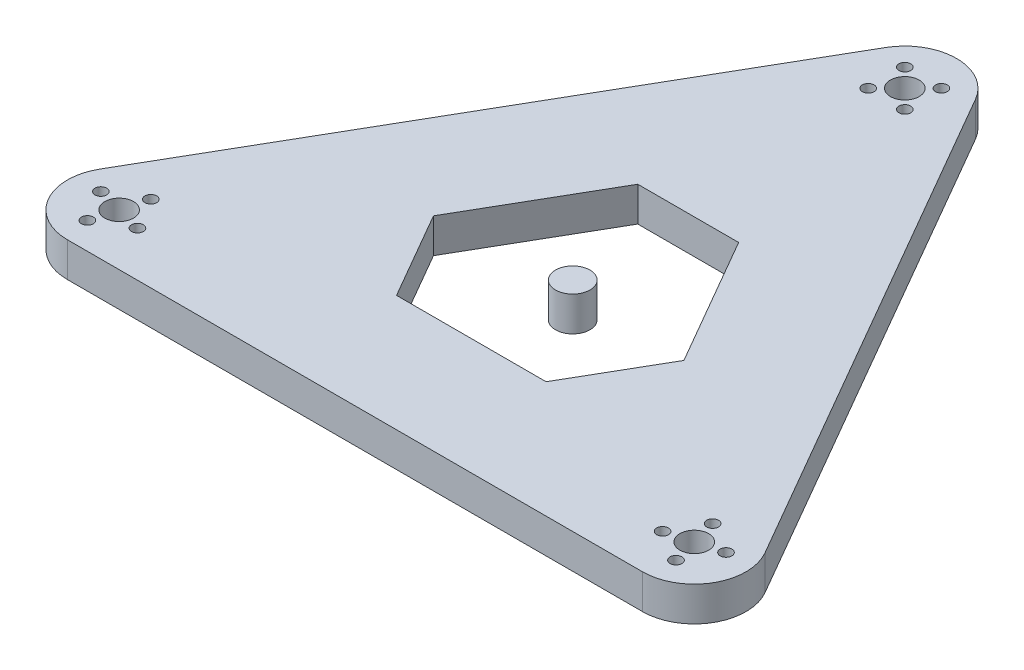
ISO-10303-21;
HEADER;
FILE_DESCRIPTION(('STEP AP214'),'2;1');
FILE_NAME('part.step','',(''),(''),'','','');
FILE_SCHEMA(('AUTOMOTIVE_DESIGN { 1 0 10303 214 1 1 1 1 }'));
ENDSEC;
DATA;
#1=APPLICATION_CONTEXT('core data for automotive mechanical design processes');
#2=APPLICATION_PROTOCOL_DEFINITION('international standard','automotive_design',2000,#1);
#3=PRODUCT_CONTEXT('',#1,'mechanical');
#4=PRODUCT('Part','Part','',(#3));
#5=PRODUCT_RELATED_PRODUCT_CATEGORY('part','',(#4));
#6=PRODUCT_DEFINITION_FORMATION('','',#4);
#7=PRODUCT_DEFINITION_CONTEXT('part definition',#1,'design');
#8=PRODUCT_DEFINITION('design','',#6,#7);
#9=PRODUCT_DEFINITION_SHAPE('','',#8);
#10=(LENGTH_UNIT() NAMED_UNIT(*) SI_UNIT(.MILLI.,.METRE.));
#11=(NAMED_UNIT(*) PLANE_ANGLE_UNIT() SI_UNIT($,.RADIAN.));
#12=(NAMED_UNIT(*) SI_UNIT($,.STERADIAN.) SOLID_ANGLE_UNIT());
#13=UNCERTAINTY_MEASURE_WITH_UNIT(LENGTH_MEASURE(1.E-05),#10,'distance_accuracy_value','');
#14=(GEOMETRIC_REPRESENTATION_CONTEXT(3) GLOBAL_UNCERTAINTY_ASSIGNED_CONTEXT((#13)) GLOBAL_UNIT_ASSIGNED_CONTEXT((#10,
#11,#12)) REPRESENTATION_CONTEXT('',''));
#15=CARTESIAN_POINT('',(0.,0.,0.));
#16=DIRECTION('',(0.,0.,1.));
#17=DIRECTION('',(1.,0.,0.));
#18=AXIS2_PLACEMENT_3D('',#15,#16,#17);
#19=CARTESIAN_POINT('',(0.,12.,0.));
#20=DIRECTION('',(0.,-1.,0.));
#21=DIRECTION('',(0.,0.,-1.));
#22=AXIS2_PLACEMENT_3D('',#19,#20,#21);
#23=CYLINDRICAL_SURFACE('',#22,6.);
#24=CARTESIAN_POINT('',(0.,12.,0.));
#25=DIRECTION('',(0.,1.,0.));
#26=DIRECTION('',(0.,0.,1.));
#27=AXIS2_PLACEMENT_3D('',#24,#25,#26);
#28=CIRCLE('',#27,6.);
#29=CARTESIAN_POINT('',(0.,12.,6.));
#30=VERTEX_POINT('',#29);
#31=EDGE_CURVE('E12',#30,#30,#28,.T.);
#32=ORIENTED_EDGE('',*,*,#31,.F.);
#33=EDGE_LOOP('',(#32));
#34=FACE_BOUND('',#33,.T.);
#35=CARTESIAN_POINT('',(0.,0.,0.));
#36=DIRECTION('',(0.,1.,0.));
#37=DIRECTION('',(0.,0.,1.));
#38=AXIS2_PLACEMENT_3D('',#35,#36,#37);
#39=CIRCLE('',#38,6.);
#40=CARTESIAN_POINT('',(0.,0.,6.));
#41=VERTEX_POINT('',#40);
#42=EDGE_CURVE('E77',#41,#41,#39,.T.);
#43=ORIENTED_EDGE('',*,*,#42,.T.);
#44=EDGE_LOOP('',(#43));
#45=FACE_BOUND('',#44,.T.);
#46=ADVANCED_FACE('F74',(#34,#45),#23,.T.);
#47=CARTESIAN_POINT('',(0.,12.,0.));
#48=DIRECTION('',(0.,1.,0.));
#49=DIRECTION('',(0.,0.,1.));
#50=AXIS2_PLACEMENT_3D('',#47,#48,#49);
#51=PLANE('',#50);
#52=ORIENTED_EDGE('',*,*,#31,.T.);
#53=EDGE_LOOP('',(#52));
#54=FACE_BOUND('',#53,.T.);
#55=ADVANCED_FACE('F89',(#54),#51,.T.);
#56=CARTESIAN_POINT('',(0.,0.,0.));
#57=DIRECTION('',(0.,1.,0.));
#58=DIRECTION('',(0.,0.,1.));
#59=AXIS2_PLACEMENT_3D('',#56,#57,#58);
#60=PLANE('',#59);
#61=ORIENTED_EDGE('',*,*,#42,.F.);
#62=EDGE_LOOP('',(#61));
#63=FACE_BOUND('',#62,.T.);
#64=ADVANCED_FACE('F87',(#63),#60,.F.);
#65=CLOSED_SHELL('',(#46,#55,#64));
#66=MANIFOLD_SOLID_BREP('B2',#65);
#67=CARTESIAN_POINT('',(100.,12.,57.7350269189626));
#68=DIRECTION('',(0.,-1.,0.));
#69=DIRECTION('',(0.,0.,-1.));
#70=AXIS2_PLACEMENT_3D('',#67,#68,#69);
#71=CYLINDRICAL_SURFACE('',#70,18.);
#72=CARTESIAN_POINT('',(100.,0.,57.7350269189626));
#73=DIRECTION('',(0.,1.,0.));
#74=DIRECTION('',(0.,0.,1.));
#75=AXIS2_PLACEMENT_3D('',#72,#73,#74);
#76=CIRCLE('',#75,18.);
#77=CARTESIAN_POINT('',(115.58845726812,0.,48.7350269189625));
#78=VERTEX_POINT('',#77);
#79=CARTESIAN_POINT('',(100.,0.,75.7350269189626));
#80=VERTEX_POINT('',#79);
#81=EDGE_CURVE('E299',#78,#80,#76,.F.);
#82=ORIENTED_EDGE('',*,*,#81,.F.);
#83=DIRECTION('',(0.,-1.,0.));
#84=VECTOR('',#83,1.);
#85=CARTESIAN_POINT('',(115.58845726812,12.,48.7350269189625));
#86=LINE('',#85,#84);
#87=CARTESIAN_POINT('',(115.58845726812,12.,48.7350269189625));
#88=VERTEX_POINT('',#87);
#89=EDGE_CURVE('E72',#88,#78,#86,.T.);
#90=ORIENTED_EDGE('',*,*,#89,.F.);
#91=CARTESIAN_POINT('',(100.,12.,57.7350269189626));
#92=DIRECTION('',(0.,1.,0.));
#93=DIRECTION('',(0.,0.,1.));
#94=AXIS2_PLACEMENT_3D('',#91,#92,#93);
#95=CIRCLE('',#94,18.);
#96=CARTESIAN_POINT('',(100.,12.,75.7350269189626));
#97=VERTEX_POINT('',#96);
#98=EDGE_CURVE('E407',#88,#97,#95,.F.);
#99=ORIENTED_EDGE('',*,*,#98,.T.);
#100=DIRECTION('',(0.,-1.,0.));
#101=VECTOR('',#100,1.);
#102=CARTESIAN_POINT('',(100.,12.,75.7350269189626));
#103=LINE('',#102,#101);
#104=EDGE_CURVE('E180',#97,#80,#103,.T.);
#105=ORIENTED_EDGE('',*,*,#104,.T.);
#106=EDGE_LOOP('',(#82,#90,#99,#105));
#107=FACE_BOUND('',#106,.T.);
#108=ADVANCED_FACE('F115',(#107),#71,.T.);
#109=CARTESIAN_POINT('',(65.5884572681199,12.,-37.8675134594813));
#110=DIRECTION('',(-0.866025403784439,0.,0.5));
#111=DIRECTION('',(0.5,0.,0.866025403784439));
#112=AXIS2_PLACEMENT_3D('',#109,#110,#111);
#113=PLANE('',#112);
#114=DIRECTION('',(-0.5,0.,-0.866025403784439));
#115=VECTOR('',#114,1.);
#116=CARTESIAN_POINT('',(65.5884572681199,0.,-37.8675134594813));
#117=LINE('',#116,#115);
#118=CARTESIAN_POINT('',(15.5884572681199,0.,-124.470053837925));
#119=VERTEX_POINT('',#118);
#120=EDGE_CURVE('E302',#78,#119,#117,.T.);
#121=ORIENTED_EDGE('',*,*,#120,.T.);
#122=DIRECTION('',(0.,-1.,0.));
#123=VECTOR('',#122,1.);
#124=CARTESIAN_POINT('',(15.5884572681199,12.,-124.470053837925));
#125=LINE('',#124,#123);
#126=CARTESIAN_POINT('',(15.5884572681199,12.,-124.470053837925));
#127=VERTEX_POINT('',#126);
#128=EDGE_CURVE('E125',#127,#119,#125,.T.);
#129=ORIENTED_EDGE('',*,*,#128,.F.);
#130=DIRECTION('',(-0.5,0.,-0.866025403784439));
#131=VECTOR('',#130,1.);
#132=CARTESIAN_POINT('',(65.5884572681199,12.,-37.8675134594813));
#133=LINE('',#132,#131);
#134=EDGE_CURVE('E409',#88,#127,#133,.T.);
#135=ORIENTED_EDGE('',*,*,#134,.F.);
#136=ORIENTED_EDGE('',*,*,#89,.T.);
#137=EDGE_LOOP('',(#121,#129,#135,#136));
#138=FACE_BOUND('',#137,.T.);
#139=ADVANCED_FACE('F413',(#138),#113,.F.);
#140=CARTESIAN_POINT('',(0.,12.,-115.470053837925));
#141=DIRECTION('',(0.,-1.,0.));
#142=DIRECTION('',(0.,0.,-1.));
#143=AXIS2_PLACEMENT_3D('',#140,#141,#142);
#144=CYLINDRICAL_SURFACE('',#143,18.);
#145=CARTESIAN_POINT('',(0.,0.,-115.470053837925));
#146=DIRECTION('',(0.,1.,0.));
#147=DIRECTION('',(0.,0.,1.));
#148=AXIS2_PLACEMENT_3D('',#145,#146,#147);
#149=CIRCLE('',#148,18.);
#150=CARTESIAN_POINT('',(-15.5884572681199,0.,-124.470053837925));
#151=VERTEX_POINT('',#150);
#152=EDGE_CURVE('E305',#119,#151,#149,.T.);
#153=ORIENTED_EDGE('',*,*,#152,.T.);
#154=DIRECTION('',(0.,-1.,0.));
#155=VECTOR('',#154,1.);
#156=CARTESIAN_POINT('',(-15.5884572681199,12.,-124.470053837925));
#157=LINE('',#156,#155);
#158=CARTESIAN_POINT('',(-15.5884572681199,12.,-124.470053837925));
#159=VERTEX_POINT('',#158);
#160=EDGE_CURVE('E233',#159,#151,#157,.T.);
#161=ORIENTED_EDGE('',*,*,#160,.F.);
#162=CARTESIAN_POINT('',(0.,12.,-115.470053837925));
#163=DIRECTION('',(0.,1.,0.));
#164=DIRECTION('',(0.,0.,1.));
#165=AXIS2_PLACEMENT_3D('',#162,#163,#164);
#166=CIRCLE('',#165,18.);
#167=EDGE_CURVE('E221',#127,#159,#166,.T.);
#168=ORIENTED_EDGE('',*,*,#167,.F.);
#169=ORIENTED_EDGE('',*,*,#128,.T.);
#170=EDGE_LOOP('',(#153,#161,#168,#169));
#171=FACE_BOUND('',#170,.T.);
#172=ADVANCED_FACE('F416',(#171),#144,.T.);
#173=CARTESIAN_POINT('',(-65.5884572681199,12.,-37.8675134594813));
#174=DIRECTION('',(0.866025403784438,0.,0.5));
#175=DIRECTION('',(0.5,0.,-0.866025403784439));
#176=AXIS2_PLACEMENT_3D('',#173,#174,#175);
#177=PLANE('',#176);
#178=DIRECTION('',(-0.5,0.,0.866025403784439));
#179=VECTOR('',#178,1.);
#180=CARTESIAN_POINT('',(-65.5884572681199,0.,-37.8675134594813));
#181=LINE('',#180,#179);
#182=CARTESIAN_POINT('',(-115.58845726812,0.,48.7350269189626));
#183=VERTEX_POINT('',#182);
#184=EDGE_CURVE('E229',#151,#183,#181,.T.);
#185=ORIENTED_EDGE('',*,*,#184,.T.);
#186=DIRECTION('',(0.,-1.,0.));
#187=VECTOR('',#186,1.);
#188=CARTESIAN_POINT('',(-115.58845726812,12.,48.7350269189626));
#189=LINE('',#188,#187);
#190=CARTESIAN_POINT('',(-115.58845726812,12.,48.7350269189626));
#191=VERTEX_POINT('',#190);
#192=EDGE_CURVE('E227',#191,#183,#189,.T.);
#193=ORIENTED_EDGE('',*,*,#192,.F.);
#194=DIRECTION('',(-0.5,0.,0.866025403784439));
#195=VECTOR('',#194,1.);
#196=CARTESIAN_POINT('',(-65.5884572681199,12.,-37.8675134594813));
#197=LINE('',#196,#195);
#198=EDGE_CURVE('E214',#159,#191,#197,.T.);
#199=ORIENTED_EDGE('',*,*,#198,.F.);
#200=ORIENTED_EDGE('',*,*,#160,.T.);
#201=EDGE_LOOP('',(#185,#193,#199,#200));
#202=FACE_BOUND('',#201,.T.);
#203=ADVANCED_FACE('F228',(#202),#177,.F.);
#204=CARTESIAN_POINT('',(-100.,12.,57.7350269189626));
#205=DIRECTION('',(0.,-1.,0.));
#206=DIRECTION('',(0.,0.,-1.));
#207=AXIS2_PLACEMENT_3D('',#204,#205,#206);
#208=CYLINDRICAL_SURFACE('',#207,18.);
#209=CARTESIAN_POINT('',(-100.,0.,57.7350269189626));
#210=DIRECTION('',(0.,1.,0.));
#211=DIRECTION('',(0.,0.,1.));
#212=AXIS2_PLACEMENT_3D('',#209,#210,#211);
#213=CIRCLE('',#212,18.);
#214=CARTESIAN_POINT('',(-100.,0.,75.7350269189626));
#215=VERTEX_POINT('',#214);
#216=EDGE_CURVE('E309',#215,#183,#213,.F.);
#217=ORIENTED_EDGE('',*,*,#216,.F.);
#218=DIRECTION('',(0.,-1.,0.));
#219=VECTOR('',#218,1.);
#220=CARTESIAN_POINT('',(-100.,12.,75.7350269189626));
#221=LINE('',#220,#219);
#222=CARTESIAN_POINT('',(-100.,12.,75.7350269189626));
#223=VERTEX_POINT('',#222);
#224=EDGE_CURVE('E173',#223,#215,#221,.T.);
#225=ORIENTED_EDGE('',*,*,#224,.F.);
#226=CARTESIAN_POINT('',(-100.,12.,57.7350269189626));
#227=DIRECTION('',(0.,1.,0.));
#228=DIRECTION('',(0.,0.,1.));
#229=AXIS2_PLACEMENT_3D('',#226,#227,#228);
#230=CIRCLE('',#229,18.);
#231=EDGE_CURVE('E219',#223,#191,#230,.F.);
#232=ORIENTED_EDGE('',*,*,#231,.T.);
#233=ORIENTED_EDGE('',*,*,#192,.T.);
#234=EDGE_LOOP('',(#217,#225,#232,#233));
#235=FACE_BOUND('',#234,.T.);
#236=ADVANCED_FACE('F235',(#235),#208,.T.);
#237=CARTESIAN_POINT('',(-34.7733831043548,12.,20.0764220959333));
#238=DIRECTION('',(-0.866025403784438,0.,0.500000000000001));
#239=DIRECTION('',(0.500000000000001,0.,0.866025403784438));
#240=AXIS2_PLACEMENT_3D('',#237,#238,#239);
#241=PLANE('',#240);
#242=DIRECTION('',(-0.500000000000001,0.,-0.866025403784438));
#243=VECTOR('',#242,1.);
#244=CARTESIAN_POINT('',(-34.7733831043548,0.,20.0764220959333));
#245=LINE('',#244,#243);
#246=CARTESIAN_POINT('',(-26.0052928171816,0.,35.2631999586683));
#247=VERTEX_POINT('',#246);
#248=CARTESIAN_POINT('',(-43.541473391528,0.,4.88964423319812));
#249=VERTEX_POINT('',#248);
#250=EDGE_CURVE('E286',#247,#249,#245,.T.);
#251=ORIENTED_EDGE('',*,*,#250,.T.);
#252=DIRECTION('',(0.,-1.,0.));
#253=VECTOR('',#252,1.);
#254=CARTESIAN_POINT('',(-43.541473391528,12.,4.88964423319812));
#255=LINE('',#254,#253);
#256=CARTESIAN_POINT('',(-43.541473391528,12.,4.88964423319812));
#257=VERTEX_POINT('',#256);
#258=EDGE_CURVE('E119',#257,#249,#255,.T.);
#259=ORIENTED_EDGE('',*,*,#258,.F.);
#260=DIRECTION('',(-0.500000000000001,0.,-0.866025403784438));
#261=VECTOR('',#260,1.);
#262=CARTESIAN_POINT('',(-34.7733831043548,12.,20.0764220959333));
#263=LINE('',#262,#261);
#264=CARTESIAN_POINT('',(-26.0052928171816,12.,35.2631999586683));
#265=VERTEX_POINT('',#264);
#266=EDGE_CURVE('E778',#265,#257,#263,.T.);
#267=ORIENTED_EDGE('',*,*,#266,.F.);
#268=DIRECTION('',(0.,-1.,0.));
#269=VECTOR('',#268,1.);
#270=CARTESIAN_POINT('',(-26.0052928171816,12.,35.2631999586683));
#271=LINE('',#270,#269);
#272=EDGE_CURVE('E282',#265,#247,#271,.T.);
#273=ORIENTED_EDGE('',*,*,#272,.T.);
#274=EDGE_LOOP('',(#251,#259,#267,#273));
#275=FACE_BOUND('',#274,.T.);
#276=ADVANCED_FACE('F381',(#275),#241,.F.);
#277=CARTESIAN_POINT('',(-30.5388269829372,12.,-17.6315999793342));
#278=DIRECTION('',(-0.866025403784439,0.,-0.5));
#279=DIRECTION('',(-0.5,0.,0.866025403784439));
#280=AXIS2_PLACEMENT_3D('',#277,#278,#279);
#281=PLANE('',#280);
#282=DIRECTION('',(0.5,0.,-0.866025403784439));
#283=VECTOR('',#282,1.);
#284=CARTESIAN_POINT('',(-30.5388269829372,0.,-17.6315999793342));
#285=LINE('',#284,#283);
#286=CARTESIAN_POINT('',(-17.5361805743464,0.,-40.1528441918664));
#287=VERTEX_POINT('',#286);
#288=EDGE_CURVE('E289',#249,#287,#285,.T.);
#289=ORIENTED_EDGE('',*,*,#288,.T.);
#290=DIRECTION('',(0.,-1.,0.));
#291=VECTOR('',#290,1.);
#292=CARTESIAN_POINT('',(-17.5361805743464,12.,-40.1528441918664));
#293=LINE('',#292,#291);
#294=CARTESIAN_POINT('',(-17.5361805743464,12.,-40.1528441918664));
#295=VERTEX_POINT('',#294);
#296=EDGE_CURVE('E371',#295,#287,#293,.T.);
#297=ORIENTED_EDGE('',*,*,#296,.F.);
#298=DIRECTION('',(0.5,0.,-0.866025403784439));
#299=VECTOR('',#298,1.);
#300=CARTESIAN_POINT('',(-30.5388269829372,12.,-17.6315999793342));
#301=LINE('',#300,#299);
#302=EDGE_CURVE('E188',#257,#295,#301,.T.);
#303=ORIENTED_EDGE('',*,*,#302,.F.);
#304=ORIENTED_EDGE('',*,*,#258,.T.);
#305=EDGE_LOOP('',(#289,#297,#303,#304));
#306=FACE_BOUND('',#305,.T.);
#307=ADVANCED_FACE('F377',(#306),#281,.F.);
#308=CARTESIAN_POINT('',(0.,12.,-40.1528441918664));
#309=DIRECTION('',(0.,0.,-1.));
#310=DIRECTION('',(-1.,0.,0.));
#311=AXIS2_PLACEMENT_3D('',#308,#309,#310);
#312=PLANE('',#311);
#313=DIRECTION('',(1.,0.,0.));
#314=VECTOR('',#313,1.);
#315=CARTESIAN_POINT('',(0.,0.,-40.1528441918664));
#316=LINE('',#315,#314);
#317=CARTESIAN_POINT('',(17.5361805743462,0.,-40.1528441918664));
#318=VERTEX_POINT('',#317);
#319=EDGE_CURVE('E291',#287,#318,#316,.T.);
#320=ORIENTED_EDGE('',*,*,#319,.T.);
#321=DIRECTION('',(0.,-1.,0.));
#322=VECTOR('',#321,1.);
#323=CARTESIAN_POINT('',(17.5361805743462,12.,-40.1528441918664));
#324=LINE('',#323,#322);
#325=CARTESIAN_POINT('',(17.5361805743462,12.,-40.1528441918664));
#326=VERTEX_POINT('',#325);
#327=EDGE_CURVE('E369',#326,#318,#324,.T.);
#328=ORIENTED_EDGE('',*,*,#327,.F.);
#329=DIRECTION('',(1.,0.,0.));
#330=VECTOR('',#329,1.);
#331=CARTESIAN_POINT('',(0.,12.,-40.1528441918664));
#332=LINE('',#331,#330);
#333=EDGE_CURVE('E399',#295,#326,#332,.T.);
#334=ORIENTED_EDGE('',*,*,#333,.F.);
#335=ORIENTED_EDGE('',*,*,#296,.T.);
#336=EDGE_LOOP('',(#320,#328,#334,#335));
#337=FACE_BOUND('',#336,.T.);
#338=ADVANCED_FACE('F390',(#337),#312,.F.);
#339=CARTESIAN_POINT('',(30.538826982937,12.,-17.6315999793342));
#340=DIRECTION('',(0.866025403784438,0.,-0.500000000000001));
#341=DIRECTION('',(-0.500000000000001,0.,-0.866025403784438));
#342=AXIS2_PLACEMENT_3D('',#339,#340,#341);
#343=PLANE('',#342);
#344=DIRECTION('',(0.500000000000001,0.,0.866025403784438));
#345=VECTOR('',#344,1.);
#346=CARTESIAN_POINT('',(30.538826982937,0.,-17.6315999793342));
#347=LINE('',#346,#345);
#348=CARTESIAN_POINT('',(43.5414733915279,0.,4.8896442331981));
#349=VERTEX_POINT('',#348);
#350=EDGE_CURVE('E293',#318,#349,#347,.T.);
#351=ORIENTED_EDGE('',*,*,#350,.T.);
#352=DIRECTION('',(0.,-1.,0.));
#353=VECTOR('',#352,1.);
#354=CARTESIAN_POINT('',(43.5414733915279,12.,4.8896442331981));
#355=LINE('',#354,#353);
#356=CARTESIAN_POINT('',(43.5414733915279,12.,4.8896442331981));
#357=VERTEX_POINT('',#356);
#358=EDGE_CURVE('E366',#357,#349,#355,.T.);
#359=ORIENTED_EDGE('',*,*,#358,.F.);
#360=DIRECTION('',(0.500000000000001,0.,0.866025403784438));
#361=VECTOR('',#360,1.);
#362=CARTESIAN_POINT('',(30.538826982937,12.,-17.6315999793342));
#363=LINE('',#362,#361);
#364=EDGE_CURVE('E395',#326,#357,#363,.T.);
#365=ORIENTED_EDGE('',*,*,#364,.F.);
#366=ORIENTED_EDGE('',*,*,#327,.T.);
#367=EDGE_LOOP('',(#351,#359,#365,#366));
#368=FACE_BOUND('',#367,.T.);
#369=ADVANCED_FACE('F393',(#368),#343,.F.);
#370=CARTESIAN_POINT('',(34.7733831043547,12.,20.0764220959332));
#371=DIRECTION('',(0.866025403784439,0.,0.5));
#372=DIRECTION('',(0.5,0.,-0.866025403784439));
#373=AXIS2_PLACEMENT_3D('',#370,#371,#372);
#374=PLANE('',#373);
#375=DIRECTION('',(-0.5,0.,0.866025403784439));
#376=VECTOR('',#375,1.);
#377=CARTESIAN_POINT('',(34.7733831043547,0.,20.0764220959332));
#378=LINE('',#377,#376);
#379=CARTESIAN_POINT('',(26.0052928171816,0.,35.2631999586683));
#380=VERTEX_POINT('',#379);
#381=EDGE_CURVE('E295',#349,#380,#378,.T.);
#382=ORIENTED_EDGE('',*,*,#381,.T.);
#383=DIRECTION('',(0.,-1.,0.));
#384=VECTOR('',#383,1.);
#385=CARTESIAN_POINT('',(26.0052928171816,12.,35.2631999586683));
#386=LINE('',#385,#384);
#387=CARTESIAN_POINT('',(26.0052928171816,12.,35.2631999586683));
#388=VERTEX_POINT('',#387);
#389=EDGE_CURVE('E363',#388,#380,#386,.T.);
#390=ORIENTED_EDGE('',*,*,#389,.F.);
#391=DIRECTION('',(-0.5,0.,0.866025403784439));
#392=VECTOR('',#391,1.);
#393=CARTESIAN_POINT('',(34.7733831043547,12.,20.0764220959332));
#394=LINE('',#393,#392);
#395=EDGE_CURVE('E398',#357,#388,#394,.T.);
#396=ORIENTED_EDGE('',*,*,#395,.F.);
#397=ORIENTED_EDGE('',*,*,#358,.T.);
#398=EDGE_LOOP('',(#382,#390,#396,#397));
#399=FACE_BOUND('',#398,.T.);
#400=ADVANCED_FACE('F431',(#399),#374,.F.);
#401=CARTESIAN_POINT('',(102.329371405923,12.,66.4283593555642));
#402=DIRECTION('',(0.,-1.,0.));
#403=DIRECTION('',(0.,0.,-1.));
#404=AXIS2_PLACEMENT_3D('',#401,#402,#403);
#405=CYLINDRICAL_SURFACE('',#404,2.04999999999994);
#406=CARTESIAN_POINT('',(102.329371405923,12.,66.4283593555642));
#407=DIRECTION('',(0.,1.,0.));
#408=DIRECTION('',(0.,0.,1.));
#409=AXIS2_PLACEMENT_3D('',#406,#407,#408);
#410=CIRCLE('',#409,2.04999999999994);
#411=CARTESIAN_POINT('',(102.329371405923,12.,68.4783593555641));
#412=VERTEX_POINT('',#411);
#413=EDGE_CURVE('E276',#412,#412,#410,.T.);
#414=ORIENTED_EDGE('',*,*,#413,.T.);
#415=EDGE_LOOP('',(#414));
#416=FACE_BOUND('',#415,.T.);
#417=CARTESIAN_POINT('',(102.329371405923,0.,66.4283593555642));
#418=DIRECTION('',(0.,1.,0.));
#419=DIRECTION('',(0.,0.,1.));
#420=AXIS2_PLACEMENT_3D('',#417,#418,#419);
#421=CIRCLE('',#420,2.04999999999994);
#422=CARTESIAN_POINT('',(102.329371405923,0.,68.4783593555641));
#423=VERTEX_POINT('',#422);
#424=EDGE_CURVE('E349',#423,#423,#421,.T.);
#425=ORIENTED_EDGE('',*,*,#424,.F.);
#426=EDGE_LOOP('',(#425));
#427=FACE_BOUND('',#426,.T.);
#428=ADVANCED_FACE('F434',(#416,#427),#405,.F.);
#429=CARTESIAN_POINT('',(97.6706285940773,12.,49.041694482361));
#430=DIRECTION('',(0.,-1.,0.));
#431=DIRECTION('',(0.,0.,-1.));
#432=AXIS2_PLACEMENT_3D('',#429,#430,#431);
#433=CYLINDRICAL_SURFACE('',#432,2.05000000000008);
#434=CARTESIAN_POINT('',(97.6706285940773,12.,49.041694482361));
#435=DIRECTION('',(0.,1.,0.));
#436=DIRECTION('',(0.,0.,1.));
#437=AXIS2_PLACEMENT_3D('',#434,#435,#436);
#438=CIRCLE('',#437,2.05000000000008);
#439=CARTESIAN_POINT('',(97.6706285940773,12.,51.091694482361));
#440=VERTEX_POINT('',#439);
#441=EDGE_CURVE('E273',#440,#440,#438,.T.);
#442=ORIENTED_EDGE('',*,*,#441,.T.);
#443=EDGE_LOOP('',(#442));
#444=FACE_BOUND('',#443,.T.);
#445=CARTESIAN_POINT('',(97.6706285940773,0.,49.041694482361));
#446=DIRECTION('',(0.,1.,0.));
#447=DIRECTION('',(0.,0.,1.));
#448=AXIS2_PLACEMENT_3D('',#445,#446,#447);
#449=CIRCLE('',#448,2.05000000000008);
#450=CARTESIAN_POINT('',(97.6706285940773,0.,51.091694482361));
#451=VERTEX_POINT('',#450);
#452=EDGE_CURVE('E346',#451,#451,#449,.T.);
#453=ORIENTED_EDGE('',*,*,#452,.F.);
#454=EDGE_LOOP('',(#453));
#455=FACE_BOUND('',#454,.T.);
#456=ADVANCED_FACE('F504',(#444,#455),#433,.F.);
#457=CARTESIAN_POINT('',(91.3066675633984,12.,60.0643983248853));
#458=DIRECTION('',(0.,-1.,0.));
#459=DIRECTION('',(0.,0.,-1.));
#460=AXIS2_PLACEMENT_3D('',#457,#458,#459);
#461=CYLINDRICAL_SURFACE('',#460,2.05000000000002);
#462=CARTESIAN_POINT('',(91.3066675633984,12.,60.0643983248853));
#463=DIRECTION('',(0.,1.,0.));
#464=DIRECTION('',(0.,0.,1.));
#465=AXIS2_PLACEMENT_3D('',#462,#463,#464);
#466=CIRCLE('',#465,2.05000000000002);
#467=CARTESIAN_POINT('',(91.3066675633984,12.,62.1143983248853));
#468=VERTEX_POINT('',#467);
#469=EDGE_CURVE('E270',#468,#468,#466,.T.);
#470=ORIENTED_EDGE('',*,*,#469,.T.);
#471=EDGE_LOOP('',(#470));
#472=FACE_BOUND('',#471,.T.);
#473=CARTESIAN_POINT('',(91.3066675633984,0.,60.0643983248853));
#474=DIRECTION('',(0.,1.,0.));
#475=DIRECTION('',(0.,0.,1.));
#476=AXIS2_PLACEMENT_3D('',#473,#474,#475);
#477=CIRCLE('',#476,2.05000000000002);
#478=CARTESIAN_POINT('',(91.3066675633984,0.,62.1143983248853));
#479=VERTEX_POINT('',#478);
#480=EDGE_CURVE('E343',#479,#479,#477,.T.);
#481=ORIENTED_EDGE('',*,*,#480,.F.);
#482=EDGE_LOOP('',(#481));
#483=FACE_BOUND('',#482,.T.);
#484=ADVANCED_FACE('F514',(#472,#483),#461,.F.);
#485=CARTESIAN_POINT('',(6.36396103067892,12.,-109.106092807246));
#486=DIRECTION('',(0.,-1.,0.));
#487=DIRECTION('',(0.,0.,-1.));
#488=AXIS2_PLACEMENT_3D('',#485,#486,#487);
#489=CYLINDRICAL_SURFACE('',#488,2.05);
#490=CARTESIAN_POINT('',(6.36396103067892,12.,-109.106092807246));
#491=DIRECTION('',(0.,1.,0.));
#492=DIRECTION('',(0.,0.,1.));
#493=AXIS2_PLACEMENT_3D('',#490,#491,#492);
#494=CIRCLE('',#493,2.05);
#495=CARTESIAN_POINT('',(6.36396103067892,12.,-107.056092807246));
#496=VERTEX_POINT('',#495);
#497=EDGE_CURVE('E267',#496,#496,#494,.T.);
#498=ORIENTED_EDGE('',*,*,#497,.T.);
#499=EDGE_LOOP('',(#498));
#500=FACE_BOUND('',#499,.T.);
#501=CARTESIAN_POINT('',(6.36396103067892,0.,-109.106092807246));
#502=DIRECTION('',(0.,1.,0.));
#503=DIRECTION('',(0.,0.,1.));
#504=AXIS2_PLACEMENT_3D('',#501,#502,#503);
#505=CIRCLE('',#504,2.05);
#506=CARTESIAN_POINT('',(6.36396103067892,0.,-107.056092807246));
#507=VERTEX_POINT('',#506);
#508=EDGE_CURVE('E340',#507,#507,#505,.T.);
#509=ORIENTED_EDGE('',*,*,#508,.F.);
#510=EDGE_LOOP('',(#509));
#511=FACE_BOUND('',#510,.T.);
#512=ADVANCED_FACE('F524',(#500,#511),#489,.F.);
#513=CARTESIAN_POINT('',(-6.36396103067894,12.,-109.106092807246));
#514=DIRECTION('',(0.,-1.,0.));
#515=DIRECTION('',(0.,0.,-1.));
#516=AXIS2_PLACEMENT_3D('',#513,#514,#515);
#517=CYLINDRICAL_SURFACE('',#516,2.05);
#518=CARTESIAN_POINT('',(-6.36396103067894,12.,-109.106092807246));
#519=DIRECTION('',(0.,1.,0.));
#520=DIRECTION('',(0.,0.,1.));
#521=AXIS2_PLACEMENT_3D('',#518,#519,#520);
#522=CIRCLE('',#521,2.05);
#523=CARTESIAN_POINT('',(-6.36396103067894,12.,-107.056092807246));
#524=VERTEX_POINT('',#523);
#525=EDGE_CURVE('E264',#524,#524,#522,.T.);
#526=ORIENTED_EDGE('',*,*,#525,.T.);
#527=EDGE_LOOP('',(#526));
#528=FACE_BOUND('',#527,.T.);
#529=CARTESIAN_POINT('',(-6.36396103067894,0.,-109.106092807246));
#530=DIRECTION('',(0.,1.,0.));
#531=DIRECTION('',(0.,0.,1.));
#532=AXIS2_PLACEMENT_3D('',#529,#530,#531);
#533=CIRCLE('',#532,2.05);
#534=CARTESIAN_POINT('',(-6.36396103067894,0.,-107.056092807246));
#535=VERTEX_POINT('',#534);
#536=EDGE_CURVE('E337',#535,#535,#533,.T.);
#537=ORIENTED_EDGE('',*,*,#536,.F.);
#538=EDGE_LOOP('',(#537));
#539=FACE_BOUND('',#538,.T.);
#540=ADVANCED_FACE('F534',(#528,#539),#517,.F.);
#541=CARTESIAN_POINT('',(6.36396103067892,12.,-121.834014868604));
#542=DIRECTION('',(0.,-1.,0.));
#543=DIRECTION('',(0.,0.,-1.));
#544=AXIS2_PLACEMENT_3D('',#541,#542,#543);
#545=CYLINDRICAL_SURFACE('',#544,2.05);
#546=CARTESIAN_POINT('',(6.36396103067892,12.,-121.834014868604));
#547=DIRECTION('',(0.,1.,0.));
#548=DIRECTION('',(0.,0.,1.));
#549=AXIS2_PLACEMENT_3D('',#546,#547,#548);
#550=CIRCLE('',#549,2.05);
#551=CARTESIAN_POINT('',(6.36396103067892,12.,-119.784014868604));
#552=VERTEX_POINT('',#551);
#553=EDGE_CURVE('E261',#552,#552,#550,.T.);
#554=ORIENTED_EDGE('',*,*,#553,.T.);
#555=EDGE_LOOP('',(#554));
#556=FACE_BOUND('',#555,.T.);
#557=CARTESIAN_POINT('',(6.36396103067892,0.,-121.834014868604));
#558=DIRECTION('',(0.,1.,0.));
#559=DIRECTION('',(0.,0.,1.));
#560=AXIS2_PLACEMENT_3D('',#557,#558,#559);
#561=CIRCLE('',#560,2.05);
#562=CARTESIAN_POINT('',(6.36396103067892,0.,-119.784014868604));
#563=VERTEX_POINT('',#562);
#564=EDGE_CURVE('E334',#563,#563,#561,.T.);
#565=ORIENTED_EDGE('',*,*,#564,.F.);
#566=EDGE_LOOP('',(#565));
#567=FACE_BOUND('',#566,.T.);
#568=ADVANCED_FACE('F544',(#556,#567),#545,.F.);
#569=CARTESIAN_POINT('',(-6.36396103067894,12.,-121.834014868604));
#570=DIRECTION('',(0.,-1.,0.));
#571=DIRECTION('',(0.,0.,-1.));
#572=AXIS2_PLACEMENT_3D('',#569,#570,#571);
#573=CYLINDRICAL_SURFACE('',#572,2.05);
#574=CARTESIAN_POINT('',(-6.36396103067894,12.,-121.834014868604));
#575=DIRECTION('',(0.,1.,0.));
#576=DIRECTION('',(0.,0.,1.));
#577=AXIS2_PLACEMENT_3D('',#574,#575,#576);
#578=CIRCLE('',#577,2.05);
#579=CARTESIAN_POINT('',(-6.36396103067894,12.,-119.784014868604));
#580=VERTEX_POINT('',#579);
#581=EDGE_CURVE('E258',#580,#580,#578,.T.);
#582=ORIENTED_EDGE('',*,*,#581,.T.);
#583=EDGE_LOOP('',(#582));
#584=FACE_BOUND('',#583,.T.);
#585=CARTESIAN_POINT('',(-6.36396103067894,0.,-121.834014868604));
#586=DIRECTION('',(0.,1.,0.));
#587=DIRECTION('',(0.,0.,1.));
#588=AXIS2_PLACEMENT_3D('',#585,#586,#587);
#589=CIRCLE('',#588,2.05);
#590=CARTESIAN_POINT('',(-6.36396103067894,0.,-119.784014868604));
#591=VERTEX_POINT('',#590);
#592=EDGE_CURVE('E331',#591,#591,#589,.T.);
#593=ORIENTED_EDGE('',*,*,#592,.F.);
#594=EDGE_LOOP('',(#593));
#595=FACE_BOUND('',#594,.T.);
#596=ADVANCED_FACE('F554',(#584,#595),#573,.F.);
#597=CARTESIAN_POINT('',(-91.3066675633984,12.,60.0643983248853));
#598=DIRECTION('',(0.,-1.,0.));
#599=DIRECTION('',(0.,0.,-1.));
#600=AXIS2_PLACEMENT_3D('',#597,#598,#599);
#601=CYLINDRICAL_SURFACE('',#600,2.05000000000001);
#602=CARTESIAN_POINT('',(-91.3066675633984,12.,60.0643983248853));
#603=DIRECTION('',(0.,1.,0.));
#604=DIRECTION('',(0.,0.,1.));
#605=AXIS2_PLACEMENT_3D('',#602,#603,#604);
#606=CIRCLE('',#605,2.05000000000001);
#607=CARTESIAN_POINT('',(-91.3066675633984,12.,62.1143983248853));
#608=VERTEX_POINT('',#607);
#609=EDGE_CURVE('E255',#608,#608,#606,.T.);
#610=ORIENTED_EDGE('',*,*,#609,.T.);
#611=EDGE_LOOP('',(#610));
#612=FACE_BOUND('',#611,.T.);
#613=CARTESIAN_POINT('',(-91.3066675633984,0.,60.0643983248853));
#614=DIRECTION('',(0.,1.,0.));
#615=DIRECTION('',(0.,0.,1.));
#616=AXIS2_PLACEMENT_3D('',#613,#614,#615);
#617=CIRCLE('',#616,2.05000000000001);
#618=CARTESIAN_POINT('',(-91.3066675633984,0.,62.1143983248853));
#619=VERTEX_POINT('',#618);
#620=EDGE_CURVE('E328',#619,#619,#617,.T.);
#621=ORIENTED_EDGE('',*,*,#620,.F.);
#622=EDGE_LOOP('',(#621));
#623=FACE_BOUND('',#622,.T.);
#624=ADVANCED_FACE('F564',(#612,#623),#601,.F.);
#625=CARTESIAN_POINT('',(-102.329371405923,12.,66.4283593555642));
#626=DIRECTION('',(0.,-1.,0.));
#627=DIRECTION('',(0.,0.,-1.));
#628=AXIS2_PLACEMENT_3D('',#625,#626,#627);
#629=CYLINDRICAL_SURFACE('',#628,2.04999999999995);
#630=CARTESIAN_POINT('',(-102.329371405923,12.,66.4283593555642));
#631=DIRECTION('',(0.,1.,0.));
#632=DIRECTION('',(0.,0.,1.));
#633=AXIS2_PLACEMENT_3D('',#630,#631,#632);
#634=CIRCLE('',#633,2.04999999999995);
#635=CARTESIAN_POINT('',(-102.329371405923,12.,68.4783593555642));
#636=VERTEX_POINT('',#635);
#637=EDGE_CURVE('E252',#636,#636,#634,.T.);
#638=ORIENTED_EDGE('',*,*,#637,.T.);
#639=EDGE_LOOP('',(#638));
#640=FACE_BOUND('',#639,.T.);
#641=CARTESIAN_POINT('',(-102.329371405923,0.,66.4283593555642));
#642=DIRECTION('',(0.,1.,0.));
#643=DIRECTION('',(0.,0.,1.));
#644=AXIS2_PLACEMENT_3D('',#641,#642,#643);
#645=CIRCLE('',#644,2.04999999999995);
#646=CARTESIAN_POINT('',(-102.329371405923,0.,68.4783593555642));
#647=VERTEX_POINT('',#646);
#648=EDGE_CURVE('E325',#647,#647,#645,.T.);
#649=ORIENTED_EDGE('',*,*,#648,.F.);
#650=EDGE_LOOP('',(#649));
#651=FACE_BOUND('',#650,.T.);
#652=ADVANCED_FACE('F574',(#640,#651),#629,.F.);
#653=CARTESIAN_POINT('',(-97.6706285940773,12.,49.041694482361));
#654=DIRECTION('',(0.,-1.,0.));
#655=DIRECTION('',(0.,0.,-1.));
#656=AXIS2_PLACEMENT_3D('',#653,#654,#655);
#657=CYLINDRICAL_SURFACE('',#656,2.05000000000003);
#658=CARTESIAN_POINT('',(-97.6706285940773,12.,49.041694482361));
#659=DIRECTION('',(0.,1.,0.));
#660=DIRECTION('',(0.,0.,1.));
#661=AXIS2_PLACEMENT_3D('',#658,#659,#660);
#662=CIRCLE('',#661,2.05000000000003);
#663=CARTESIAN_POINT('',(-97.6706285940773,12.,51.091694482361));
#664=VERTEX_POINT('',#663);
#665=EDGE_CURVE('E249',#664,#664,#662,.T.);
#666=ORIENTED_EDGE('',*,*,#665,.T.);
#667=EDGE_LOOP('',(#666));
#668=FACE_BOUND('',#667,.T.);
#669=CARTESIAN_POINT('',(-97.6706285940773,0.,49.041694482361));
#670=DIRECTION('',(0.,1.,0.));
#671=DIRECTION('',(0.,0.,1.));
#672=AXIS2_PLACEMENT_3D('',#669,#670,#671);
#673=CIRCLE('',#672,2.05000000000003);
#674=CARTESIAN_POINT('',(-97.6706285940773,0.,51.091694482361));
#675=VERTEX_POINT('',#674);
#676=EDGE_CURVE('E322',#675,#675,#673,.T.);
#677=ORIENTED_EDGE('',*,*,#676,.F.);
#678=EDGE_LOOP('',(#677));
#679=FACE_BOUND('',#678,.T.);
#680=ADVANCED_FACE('F584',(#668,#679),#657,.F.);
#681=CARTESIAN_POINT('',(-108.693332436602,12.,55.4056555130399));
#682=DIRECTION('',(0.,-1.,0.));
#683=DIRECTION('',(0.,0.,-1.));
#684=AXIS2_PLACEMENT_3D('',#681,#682,#683);
#685=CYLINDRICAL_SURFACE('',#684,2.05000000000003);
#686=CARTESIAN_POINT('',(-108.693332436602,12.,55.4056555130399));
#687=DIRECTION('',(0.,1.,0.));
#688=DIRECTION('',(0.,0.,1.));
#689=AXIS2_PLACEMENT_3D('',#686,#687,#688);
#690=CIRCLE('',#689,2.05000000000003);
#691=CARTESIAN_POINT('',(-108.693332436602,12.,57.4556555130399));
#692=VERTEX_POINT('',#691);
#693=EDGE_CURVE('E246',#692,#692,#690,.T.);
#694=ORIENTED_EDGE('',*,*,#693,.T.);
#695=EDGE_LOOP('',(#694));
#696=FACE_BOUND('',#695,.T.);
#697=CARTESIAN_POINT('',(-108.693332436602,0.,55.4056555130399));
#698=DIRECTION('',(0.,1.,0.));
#699=DIRECTION('',(0.,0.,1.));
#700=AXIS2_PLACEMENT_3D('',#697,#698,#699);
#701=CIRCLE('',#700,2.05000000000003);
#702=CARTESIAN_POINT('',(-108.693332436602,0.,57.4556555130399));
#703=VERTEX_POINT('',#702);
#704=EDGE_CURVE('E319',#703,#703,#701,.T.);
#705=ORIENTED_EDGE('',*,*,#704,.F.);
#706=EDGE_LOOP('',(#705));
#707=FACE_BOUND('',#706,.T.);
#708=ADVANCED_FACE('F594',(#696,#707),#685,.F.);
#709=CARTESIAN_POINT('',(100.,12.,57.7350269189626));
#710=DIRECTION('',(0.,-1.,0.));
#711=DIRECTION('',(0.,0.,-1.));
#712=AXIS2_PLACEMENT_3D('',#709,#710,#711);
#713=CYLINDRICAL_SURFACE('',#712,5.00000000000001);
#714=CARTESIAN_POINT('',(100.,12.,57.7350269189626));
#715=DIRECTION('',(0.,1.,0.));
#716=DIRECTION('',(0.,0.,1.));
#717=AXIS2_PLACEMENT_3D('',#714,#715,#716);
#718=CIRCLE('',#717,5.00000000000001);
#719=CARTESIAN_POINT('',(100.,12.,62.7350269189626));
#720=VERTEX_POINT('',#719);
#721=EDGE_CURVE('E243',#720,#720,#718,.T.);
#722=ORIENTED_EDGE('',*,*,#721,.T.);
#723=EDGE_LOOP('',(#722));
#724=FACE_BOUND('',#723,.T.);
#725=CARTESIAN_POINT('',(100.,0.,57.7350269189626));
#726=DIRECTION('',(0.,1.,0.));
#727=DIRECTION('',(0.,0.,1.));
#728=AXIS2_PLACEMENT_3D('',#725,#726,#727);
#729=CIRCLE('',#728,5.00000000000001);
#730=CARTESIAN_POINT('',(100.,0.,62.7350269189626));
#731=VERTEX_POINT('',#730);
#732=EDGE_CURVE('E316',#731,#731,#729,.T.);
#733=ORIENTED_EDGE('',*,*,#732,.F.);
#734=EDGE_LOOP('',(#733));
#735=FACE_BOUND('',#734,.T.);
#736=ADVANCED_FACE('F604',(#724,#735),#713,.F.);
#737=CARTESIAN_POINT('',(-100.,12.,57.7350269189626));
#738=DIRECTION('',(0.,-1.,0.));
#739=DIRECTION('',(0.,0.,-1.));
#740=AXIS2_PLACEMENT_3D('',#737,#738,#739);
#741=CYLINDRICAL_SURFACE('',#740,5.00000000000002);
#742=CARTESIAN_POINT('',(-100.,12.,57.7350269189626));
#743=DIRECTION('',(0.,1.,0.));
#744=DIRECTION('',(0.,0.,1.));
#745=AXIS2_PLACEMENT_3D('',#742,#743,#744);
#746=CIRCLE('',#745,5.00000000000002);
#747=CARTESIAN_POINT('',(-100.,12.,62.7350269189626));
#748=VERTEX_POINT('',#747);
#749=EDGE_CURVE('E237',#748,#748,#746,.T.);
#750=ORIENTED_EDGE('',*,*,#749,.T.);
#751=EDGE_LOOP('',(#750));
#752=FACE_BOUND('',#751,.T.);
#753=CARTESIAN_POINT('',(-100.,0.,57.7350269189626));
#754=DIRECTION('',(0.,1.,0.));
#755=DIRECTION('',(0.,0.,1.));
#756=AXIS2_PLACEMENT_3D('',#753,#754,#755);
#757=CIRCLE('',#756,5.00000000000002);
#758=CARTESIAN_POINT('',(-100.,0.,62.7350269189626));
#759=VERTEX_POINT('',#758);
#760=EDGE_CURVE('E313',#759,#759,#757,.T.);
#761=ORIENTED_EDGE('',*,*,#760,.F.);
#762=EDGE_LOOP('',(#761));
#763=FACE_BOUND('',#762,.T.);
#764=ADVANCED_FACE('F614',(#752,#763),#741,.F.);
#765=CARTESIAN_POINT('',(0.,12.,75.7350269189626));
#766=DIRECTION('',(0.,0.,-1.));
#767=DIRECTION('',(-1.,0.,0.));
#768=AXIS2_PLACEMENT_3D('',#765,#766,#767);
#769=PLANE('',#768);
#770=DIRECTION('',(1.,0.,0.));
#771=VECTOR('',#770,1.);
#772=CARTESIAN_POINT('',(0.,0.,75.7350269189626));
#773=LINE('',#772,#771);
#774=EDGE_CURVE('E311',#215,#80,#773,.T.);
#775=ORIENTED_EDGE('',*,*,#774,.T.);
#776=ORIENTED_EDGE('',*,*,#104,.F.);
#777=DIRECTION('',(1.,0.,0.));
#778=VECTOR('',#777,1.);
#779=CARTESIAN_POINT('',(0.,12.,75.7350269189626));
#780=LINE('',#779,#778);
#781=EDGE_CURVE('E134',#223,#97,#780,.T.);
#782=ORIENTED_EDGE('',*,*,#781,.F.);
#783=ORIENTED_EDGE('',*,*,#224,.T.);
#784=EDGE_LOOP('',(#775,#776,#782,#783));
#785=FACE_BOUND('',#784,.T.);
#786=ADVANCED_FACE('F418',(#785),#769,.F.);
#787=CARTESIAN_POINT('',(0.,12.,35.2631999586683));
#788=DIRECTION('',(0.,0.,1.));
#789=DIRECTION('',(1.,0.,0.));
#790=AXIS2_PLACEMENT_3D('',#787,#788,#789);
#791=PLANE('',#790);
#792=DIRECTION('',(-1.,0.,0.));
#793=VECTOR('',#792,1.);
#794=CARTESIAN_POINT('',(0.,0.,35.2631999586683));
#795=LINE('',#794,#793);
#796=EDGE_CURVE('E297',#380,#247,#795,.T.);
#797=ORIENTED_EDGE('',*,*,#796,.T.);
#798=ORIENTED_EDGE('',*,*,#272,.F.);
#799=DIRECTION('',(-1.,0.,0.));
#800=VECTOR('',#799,1.);
#801=CARTESIAN_POINT('',(0.,12.,35.2631999586683));
#802=LINE('',#801,#800);
#803=EDGE_CURVE('E401',#388,#265,#802,.T.);
#804=ORIENTED_EDGE('',*,*,#803,.F.);
#805=ORIENTED_EDGE('',*,*,#389,.T.);
#806=EDGE_LOOP('',(#797,#798,#804,#805));
#807=FACE_BOUND('',#806,.T.);
#808=ADVANCED_FACE('F427',(#807),#791,.F.);
#809=CARTESIAN_POINT('',(0.,12.,-115.470053837925));
#810=DIRECTION('',(0.,-1.,0.));
#811=DIRECTION('',(0.,0.,-1.));
#812=AXIS2_PLACEMENT_3D('',#809,#810,#811);
#813=CYLINDRICAL_SURFACE('',#812,5.00000000000001);
#814=CARTESIAN_POINT('',(0.,12.,-115.470053837925));
#815=DIRECTION('',(0.,1.,0.));
#816=DIRECTION('',(0.,0.,1.));
#817=AXIS2_PLACEMENT_3D('',#814,#815,#816);
#818=CIRCLE('',#817,5.00000000000001);
#819=CARTESIAN_POINT('',(0.,12.,-110.470053837925));
#820=VERTEX_POINT('',#819);
#821=EDGE_CURVE('E355',#820,#820,#818,.T.);
#822=ORIENTED_EDGE('',*,*,#821,.T.);
#823=EDGE_LOOP('',(#822));
#824=FACE_BOUND('',#823,.T.);
#825=CARTESIAN_POINT('',(0.,0.,-115.470053837925));
#826=DIRECTION('',(0.,1.,0.));
#827=DIRECTION('',(0.,0.,1.));
#828=AXIS2_PLACEMENT_3D('',#825,#826,#827);
#829=CIRCLE('',#828,5.00000000000001);
#830=CARTESIAN_POINT('',(0.,0.,-110.470053837925));
#831=VERTEX_POINT('',#830);
#832=EDGE_CURVE('E283',#831,#831,#829,.T.);
#833=ORIENTED_EDGE('',*,*,#832,.F.);
#834=EDGE_LOOP('',(#833));
#835=FACE_BOUND('',#834,.T.);
#836=ADVANCED_FACE('F117',(#824,#835),#813,.F.);
#837=CARTESIAN_POINT('',(108.693332436602,12.,55.4056555130399));
#838=DIRECTION('',(0.,-1.,0.));
#839=DIRECTION('',(0.,0.,-1.));
#840=AXIS2_PLACEMENT_3D('',#837,#838,#839);
#841=CYLINDRICAL_SURFACE('',#840,2.04999999999997);
#842=CARTESIAN_POINT('',(108.693332436602,12.,55.4056555130399));
#843=DIRECTION('',(0.,1.,0.));
#844=DIRECTION('',(0.,0.,1.));
#845=AXIS2_PLACEMENT_3D('',#842,#843,#844);
#846=CIRCLE('',#845,2.04999999999997);
#847=CARTESIAN_POINT('',(108.693332436602,12.,57.4556555130398));
#848=VERTEX_POINT('',#847);
#849=EDGE_CURVE('E279',#848,#848,#846,.T.);
#850=ORIENTED_EDGE('',*,*,#849,.T.);
#851=EDGE_LOOP('',(#850));
#852=FACE_BOUND('',#851,.T.);
#853=CARTESIAN_POINT('',(108.693332436602,0.,55.4056555130399));
#854=DIRECTION('',(0.,1.,0.));
#855=DIRECTION('',(0.,0.,1.));
#856=AXIS2_PLACEMENT_3D('',#853,#854,#855);
#857=CIRCLE('',#856,2.04999999999997);
#858=CARTESIAN_POINT('',(108.693332436602,0.,57.4556555130398));
#859=VERTEX_POINT('',#858);
#860=EDGE_CURVE('E352',#859,#859,#857,.T.);
#861=ORIENTED_EDGE('',*,*,#860,.F.);
#862=EDGE_LOOP('',(#861));
#863=FACE_BOUND('',#862,.T.);
#864=ADVANCED_FACE('F648',(#852,#863),#841,.F.);
#865=CARTESIAN_POINT('',(0.,12.,0.));
#866=DIRECTION('',(0.,1.,0.));
#867=DIRECTION('',(0.,0.,1.));
#868=AXIS2_PLACEMENT_3D('',#865,#866,#867);
#869=PLANE('',#868);
#870=ORIENTED_EDGE('',*,*,#821,.F.);
#871=EDGE_LOOP('',(#870));
#872=FACE_BOUND('',#871,.T.);
#873=ORIENTED_EDGE('',*,*,#266,.T.);
#874=ORIENTED_EDGE('',*,*,#302,.T.);
#875=ORIENTED_EDGE('',*,*,#333,.T.);
#876=ORIENTED_EDGE('',*,*,#364,.T.);
#877=ORIENTED_EDGE('',*,*,#395,.T.);
#878=ORIENTED_EDGE('',*,*,#803,.T.);
#879=EDGE_LOOP('',(#873,#874,#875,#876,#877,#878));
#880=FACE_BOUND('',#879,.T.);
#881=ORIENTED_EDGE('',*,*,#98,.F.);
#882=ORIENTED_EDGE('',*,*,#134,.T.);
#883=ORIENTED_EDGE('',*,*,#167,.T.);
#884=ORIENTED_EDGE('',*,*,#198,.T.);
#885=ORIENTED_EDGE('',*,*,#231,.F.);
#886=ORIENTED_EDGE('',*,*,#781,.T.);
#887=EDGE_LOOP('',(#881,#882,#883,#884,#885,#886));
#888=FACE_BOUND('',#887,.T.);
#889=ORIENTED_EDGE('',*,*,#749,.F.);
#890=EDGE_LOOP('',(#889));
#891=FACE_BOUND('',#890,.T.);
#892=ORIENTED_EDGE('',*,*,#721,.F.);
#893=EDGE_LOOP('',(#892));
#894=FACE_BOUND('',#893,.T.);
#895=ORIENTED_EDGE('',*,*,#693,.F.);
#896=EDGE_LOOP('',(#895));
#897=FACE_BOUND('',#896,.T.);
#898=ORIENTED_EDGE('',*,*,#665,.F.);
#899=EDGE_LOOP('',(#898));
#900=FACE_BOUND('',#899,.T.);
#901=ORIENTED_EDGE('',*,*,#637,.F.);
#902=EDGE_LOOP('',(#901));
#903=FACE_BOUND('',#902,.T.);
#904=ORIENTED_EDGE('',*,*,#609,.F.);
#905=EDGE_LOOP('',(#904));
#906=FACE_BOUND('',#905,.T.);
#907=ORIENTED_EDGE('',*,*,#581,.F.);
#908=EDGE_LOOP('',(#907));
#909=FACE_BOUND('',#908,.T.);
#910=ORIENTED_EDGE('',*,*,#553,.F.);
#911=EDGE_LOOP('',(#910));
#912=FACE_BOUND('',#911,.T.);
#913=ORIENTED_EDGE('',*,*,#525,.F.);
#914=EDGE_LOOP('',(#913));
#915=FACE_BOUND('',#914,.T.);
#916=ORIENTED_EDGE('',*,*,#497,.F.);
#917=EDGE_LOOP('',(#916));
#918=FACE_BOUND('',#917,.T.);
#919=ORIENTED_EDGE('',*,*,#469,.F.);
#920=EDGE_LOOP('',(#919));
#921=FACE_BOUND('',#920,.T.);
#922=ORIENTED_EDGE('',*,*,#441,.F.);
#923=EDGE_LOOP('',(#922));
#924=FACE_BOUND('',#923,.T.);
#925=ORIENTED_EDGE('',*,*,#413,.F.);
#926=EDGE_LOOP('',(#925));
#927=FACE_BOUND('',#926,.T.);
#928=ORIENTED_EDGE('',*,*,#849,.F.);
#929=EDGE_LOOP('',(#928));
#930=FACE_BOUND('',#929,.T.);
#931=ADVANCED_FACE('F216',(#872,#880,#888,#891,#894,#897,#900,#903,#906,#909,#912,#915,#918,
#921,#924,#927,#930),#869,.T.);
#932=CARTESIAN_POINT('',(0.,0.,0.));
#933=DIRECTION('',(0.,1.,0.));
#934=DIRECTION('',(0.,0.,1.));
#935=AXIS2_PLACEMENT_3D('',#932,#933,#934);
#936=PLANE('',#935);
#937=ORIENTED_EDGE('',*,*,#832,.T.);
#938=EDGE_LOOP('',(#937));
#939=FACE_BOUND('',#938,.T.);
#940=ORIENTED_EDGE('',*,*,#250,.F.);
#941=ORIENTED_EDGE('',*,*,#796,.F.);
#942=ORIENTED_EDGE('',*,*,#381,.F.);
#943=ORIENTED_EDGE('',*,*,#350,.F.);
#944=ORIENTED_EDGE('',*,*,#319,.F.);
#945=ORIENTED_EDGE('',*,*,#288,.F.);
#946=EDGE_LOOP('',(#940,#941,#942,#943,#944,#945));
#947=FACE_BOUND('',#946,.T.);
#948=ORIENTED_EDGE('',*,*,#81,.T.);
#949=ORIENTED_EDGE('',*,*,#774,.F.);
#950=ORIENTED_EDGE('',*,*,#216,.T.);
#951=ORIENTED_EDGE('',*,*,#184,.F.);
#952=ORIENTED_EDGE('',*,*,#152,.F.);
#953=ORIENTED_EDGE('',*,*,#120,.F.);
#954=EDGE_LOOP('',(#948,#949,#950,#951,#952,#953));
#955=FACE_BOUND('',#954,.T.);
#956=ORIENTED_EDGE('',*,*,#760,.T.);
#957=EDGE_LOOP('',(#956));
#958=FACE_BOUND('',#957,.T.);
#959=ORIENTED_EDGE('',*,*,#732,.T.);
#960=EDGE_LOOP('',(#959));
#961=FACE_BOUND('',#960,.T.);
#962=ORIENTED_EDGE('',*,*,#704,.T.);
#963=EDGE_LOOP('',(#962));
#964=FACE_BOUND('',#963,.T.);
#965=ORIENTED_EDGE('',*,*,#676,.T.);
#966=EDGE_LOOP('',(#965));
#967=FACE_BOUND('',#966,.T.);
#968=ORIENTED_EDGE('',*,*,#648,.T.);
#969=EDGE_LOOP('',(#968));
#970=FACE_BOUND('',#969,.T.);
#971=ORIENTED_EDGE('',*,*,#620,.T.);
#972=EDGE_LOOP('',(#971));
#973=FACE_BOUND('',#972,.T.);
#974=ORIENTED_EDGE('',*,*,#592,.T.);
#975=EDGE_LOOP('',(#974));
#976=FACE_BOUND('',#975,.T.);
#977=ORIENTED_EDGE('',*,*,#564,.T.);
#978=EDGE_LOOP('',(#977));
#979=FACE_BOUND('',#978,.T.);
#980=ORIENTED_EDGE('',*,*,#536,.T.);
#981=EDGE_LOOP('',(#980));
#982=FACE_BOUND('',#981,.T.);
#983=ORIENTED_EDGE('',*,*,#508,.T.);
#984=EDGE_LOOP('',(#983));
#985=FACE_BOUND('',#984,.T.);
#986=ORIENTED_EDGE('',*,*,#480,.T.);
#987=EDGE_LOOP('',(#986));
#988=FACE_BOUND('',#987,.T.);
#989=ORIENTED_EDGE('',*,*,#452,.T.);
#990=EDGE_LOOP('',(#989));
#991=FACE_BOUND('',#990,.T.);
#992=ORIENTED_EDGE('',*,*,#424,.T.);
#993=EDGE_LOOP('',(#992));
#994=FACE_BOUND('',#993,.T.);
#995=ORIENTED_EDGE('',*,*,#860,.T.);
#996=EDGE_LOOP('',(#995));
#997=FACE_BOUND('',#996,.T.);
#998=ADVANCED_FACE('F385',(#939,#947,#955,#958,#961,#964,#967,#970,#973,#976,#979,#982,#985,
#988,#991,#994,#997),#936,.F.);
#999=CLOSED_SHELL('',(#108,#139,#172,#203,#236,#276,#307,#338,#369,#400,#428,#456,#484,#512,
#540,#568,#596,#624,#652,#680,#708,#736,#764,#786,#808,#836,#864,#931,#998));
#1000=MANIFOLD_SOLID_BREP('B7',#999);
#1001=ADVANCED_BREP_SHAPE_REPRESENTATION('',(#18,#66,#1000),#14);
#1002=SHAPE_DEFINITION_REPRESENTATION(#9,#1001);
ENDSEC;
END-ISO-10303-21;
